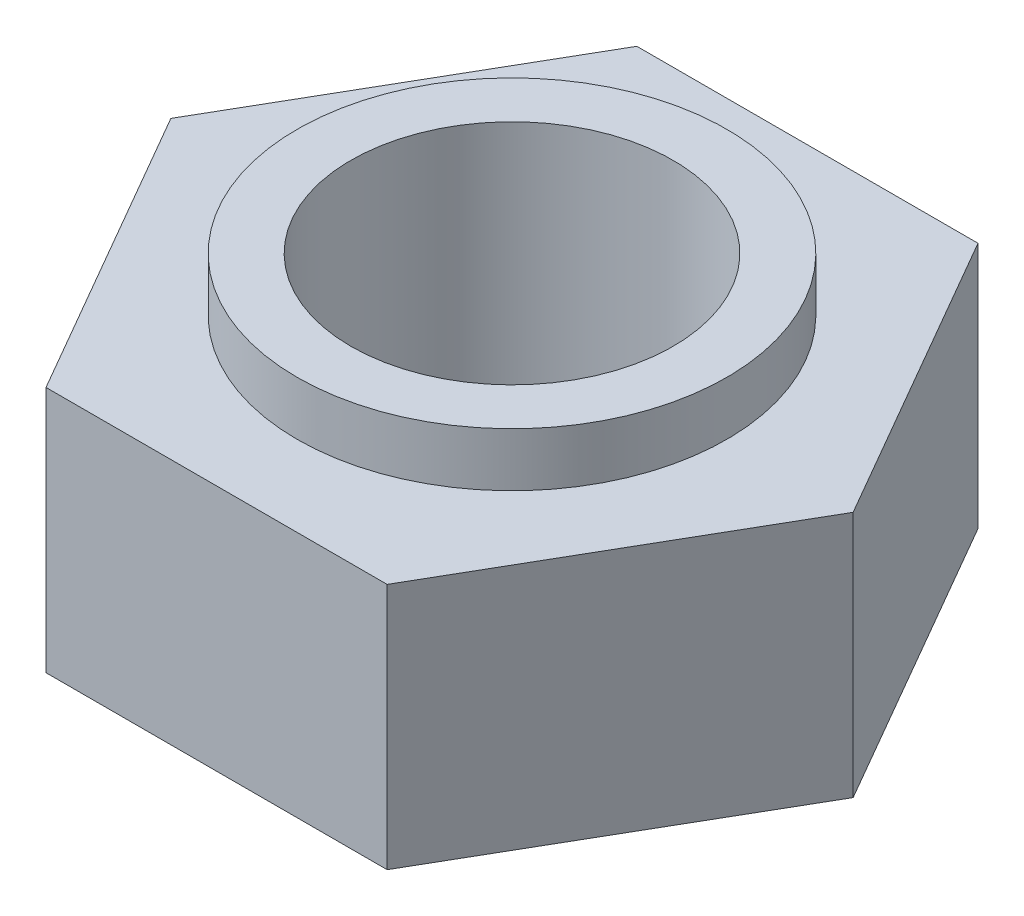
ISO-10303-21;
HEADER;
FILE_DESCRIPTION(('STEP AP214'),'2;1');
FILE_NAME('part.step','',(''),(''),'','','');
FILE_SCHEMA(('AUTOMOTIVE_DESIGN { 1 0 10303 214 1 1 1 1 }'));
ENDSEC;
DATA;
#1=APPLICATION_CONTEXT('core data for automotive mechanical design processes');
#2=APPLICATION_PROTOCOL_DEFINITION('international standard','automotive_design',2000,#1);
#3=PRODUCT_CONTEXT('',#1,'mechanical');
#4=PRODUCT('Part','Part','',(#3));
#5=PRODUCT_RELATED_PRODUCT_CATEGORY('part','',(#4));
#6=PRODUCT_DEFINITION_FORMATION('','',#4);
#7=PRODUCT_DEFINITION_CONTEXT('part definition',#1,'design');
#8=PRODUCT_DEFINITION('design','',#6,#7);
#9=PRODUCT_DEFINITION_SHAPE('','',#8);
#10=(LENGTH_UNIT() NAMED_UNIT(*) SI_UNIT(.MILLI.,.METRE.));
#11=(NAMED_UNIT(*) PLANE_ANGLE_UNIT() SI_UNIT($,.RADIAN.));
#12=(NAMED_UNIT(*) SI_UNIT($,.STERADIAN.) SOLID_ANGLE_UNIT());
#13=UNCERTAINTY_MEASURE_WITH_UNIT(LENGTH_MEASURE(1.E-05),#10,'distance_accuracy_value','');
#14=(GEOMETRIC_REPRESENTATION_CONTEXT(3) GLOBAL_UNCERTAINTY_ASSIGNED_CONTEXT((#13)) GLOBAL_UNIT_ASSIGNED_CONTEXT((#10,
#11,#12)) REPRESENTATION_CONTEXT('',''));
#15=CARTESIAN_POINT('',(0.,0.,0.));
#16=DIRECTION('',(0.,0.,1.));
#17=DIRECTION('',(1.,0.,0.));
#18=AXIS2_PLACEMENT_3D('',#15,#16,#17);
#19=CARTESIAN_POINT('',(0.,2.3,0.));
#20=DIRECTION('',(0.,1.,0.));
#21=DIRECTION('',(0.,0.,1.));
#22=AXIS2_PLACEMENT_3D('',#19,#20,#21);
#23=PLANE('',#22);
#24=DIRECTION('',(0.5,0.,-0.866025403784439));
#25=VECTOR('',#24,1.);
#26=CARTESIAN_POINT('',(1.58771324027147,2.3,2.75000000000001));
#27=LINE('',#26,#25);
#28=CARTESIAN_POINT('',(1.58771324027147,2.3,2.75000000000001));
#29=VERTEX_POINT('',#28);
#30=CARTESIAN_POINT('',(3.17542648054294,2.3,0.));
#31=VERTEX_POINT('',#30);
#32=EDGE_CURVE('E129',#29,#31,#27,.T.);
#33=ORIENTED_EDGE('',*,*,#32,.T.);
#34=DIRECTION('',(-0.500000000000001,0.,-0.866025403784438));
#35=VECTOR('',#34,1.);
#36=CARTESIAN_POINT('',(3.17542648054294,2.3,0.));
#37=LINE('',#36,#35);
#38=CARTESIAN_POINT('',(1.58771324027147,2.3,-2.75000000000001));
#39=VERTEX_POINT('',#38);
#40=EDGE_CURVE('E87',#31,#39,#37,.T.);
#41=ORIENTED_EDGE('',*,*,#40,.T.);
#42=DIRECTION('',(-1.,0.,0.));
#43=VECTOR('',#42,1.);
#44=CARTESIAN_POINT('',(1.58771324027147,2.3,-2.75000000000001));
#45=LINE('',#44,#43);
#46=CARTESIAN_POINT('',(-1.58771324027147,2.3,-2.75000000000001));
#47=VERTEX_POINT('',#46);
#48=EDGE_CURVE('E100',#39,#47,#45,.T.);
#49=ORIENTED_EDGE('',*,*,#48,.T.);
#50=DIRECTION('',(-0.5,0.,0.866025403784439));
#51=VECTOR('',#50,1.);
#52=CARTESIAN_POINT('',(-1.58771324027147,2.3,-2.75000000000001));
#53=LINE('',#52,#51);
#54=CARTESIAN_POINT('',(-3.17542648054295,2.3,0.));
#55=VERTEX_POINT('',#54);
#56=EDGE_CURVE('E94',#47,#55,#53,.T.);
#57=ORIENTED_EDGE('',*,*,#56,.T.);
#58=DIRECTION('',(0.5,0.,0.866025403784439));
#59=VECTOR('',#58,1.);
#60=CARTESIAN_POINT('',(-3.17542648054295,2.3,0.));
#61=LINE('',#60,#59);
#62=CARTESIAN_POINT('',(-1.58771324027148,2.3,2.75000000000001));
#63=VERTEX_POINT('',#62);
#64=EDGE_CURVE('E98',#55,#63,#61,.T.);
#65=ORIENTED_EDGE('',*,*,#64,.T.);
#66=DIRECTION('',(1.,0.,0.));
#67=VECTOR('',#66,1.);
#68=CARTESIAN_POINT('',(-1.58771324027148,2.3,2.75000000000001));
#69=LINE('',#68,#67);
#70=EDGE_CURVE('E50',#63,#29,#69,.T.);
#71=ORIENTED_EDGE('',*,*,#70,.T.);
#72=EDGE_LOOP('',(#33,#41,#49,#57,#65,#71));
#73=FACE_BOUND('',#72,.T.);
#74=CARTESIAN_POINT('',(0.,2.3,0.));
#75=DIRECTION('',(0.,1.,0.));
#76=DIRECTION('',(0.,0.,1.));
#77=AXIS2_PLACEMENT_3D('',#74,#75,#76);
#78=CIRCLE('',#77,2.);
#79=CARTESIAN_POINT('',(0.,2.3,2.));
#80=VERTEX_POINT('',#79);
#81=EDGE_CURVE('E180',#80,#80,#78,.T.);
#82=ORIENTED_EDGE('',*,*,#81,.F.);
#83=EDGE_LOOP('',(#82));
#84=FACE_BOUND('',#83,.T.);
#85=ADVANCED_FACE('F33',(#73,#84),#23,.T.);
#86=CARTESIAN_POINT('',(0.,0.,0.));
#87=DIRECTION('',(0.,1.,0.));
#88=DIRECTION('',(0.,0.,1.));
#89=AXIS2_PLACEMENT_3D('',#86,#87,#88);
#90=PLANE('',#89);
#91=DIRECTION('',(0.5,0.,-0.866025403784439));
#92=VECTOR('',#91,1.);
#93=CARTESIAN_POINT('',(1.58771324027147,0.,2.75000000000001));
#94=LINE('',#93,#92);
#95=CARTESIAN_POINT('',(1.58771324027147,0.,2.75000000000001));
#96=VERTEX_POINT('',#95);
#97=CARTESIAN_POINT('',(3.17542648054294,0.,0.));
#98=VERTEX_POINT('',#97);
#99=EDGE_CURVE('E118',#96,#98,#94,.T.);
#100=ORIENTED_EDGE('',*,*,#99,.F.);
#101=DIRECTION('',(1.,0.,0.));
#102=VECTOR('',#101,1.);
#103=CARTESIAN_POINT('',(-1.58771324027148,0.,2.75000000000001));
#104=LINE('',#103,#102);
#105=CARTESIAN_POINT('',(-1.58771324027148,0.,2.75000000000001));
#106=VERTEX_POINT('',#105);
#107=EDGE_CURVE('E79',#106,#96,#104,.T.);
#108=ORIENTED_EDGE('',*,*,#107,.F.);
#109=DIRECTION('',(0.5,0.,0.866025403784439));
#110=VECTOR('',#109,1.);
#111=CARTESIAN_POINT('',(-3.17542648054295,0.,0.));
#112=LINE('',#111,#110);
#113=CARTESIAN_POINT('',(-3.17542648054295,0.,0.));
#114=VERTEX_POINT('',#113);
#115=EDGE_CURVE('E73',#114,#106,#112,.T.);
#116=ORIENTED_EDGE('',*,*,#115,.F.);
#117=DIRECTION('',(-0.5,0.,0.866025403784439));
#118=VECTOR('',#117,1.);
#119=CARTESIAN_POINT('',(-1.58771324027147,0.,-2.75000000000001));
#120=LINE('',#119,#118);
#121=CARTESIAN_POINT('',(-1.58771324027147,0.,-2.75000000000001));
#122=VERTEX_POINT('',#121);
#123=EDGE_CURVE('E108',#122,#114,#120,.T.);
#124=ORIENTED_EDGE('',*,*,#123,.F.);
#125=DIRECTION('',(-1.,0.,0.));
#126=VECTOR('',#125,1.);
#127=CARTESIAN_POINT('',(1.58771324027147,0.,-2.75000000000001));
#128=LINE('',#127,#126);
#129=CARTESIAN_POINT('',(1.58771324027147,0.,-2.75000000000001));
#130=VERTEX_POINT('',#129);
#131=EDGE_CURVE('E124',#130,#122,#128,.T.);
#132=ORIENTED_EDGE('',*,*,#131,.F.);
#133=DIRECTION('',(-0.500000000000001,0.,-0.866025403784438));
#134=VECTOR('',#133,1.);
#135=CARTESIAN_POINT('',(3.17542648054294,0.,0.));
#136=LINE('',#135,#134);
#137=EDGE_CURVE('E121',#98,#130,#136,.T.);
#138=ORIENTED_EDGE('',*,*,#137,.F.);
#139=EDGE_LOOP('',(#100,#108,#116,#124,#132,#138));
#140=FACE_BOUND('',#139,.T.);
#141=CARTESIAN_POINT('',(0.,0.,0.));
#142=DIRECTION('',(0.,1.,0.));
#143=DIRECTION('',(0.,0.,1.));
#144=AXIS2_PLACEMENT_3D('',#141,#142,#143);
#145=CIRCLE('',#144,1.5);
#146=CARTESIAN_POINT('',(0.,0.,1.5));
#147=VERTEX_POINT('',#146);
#148=EDGE_CURVE('E122',#147,#147,#145,.T.);
#149=ORIENTED_EDGE('',*,*,#148,.T.);
#150=EDGE_LOOP('',(#149));
#151=FACE_BOUND('',#150,.T.);
#152=ADVANCED_FACE('F138',(#140,#151),#90,.F.);
#153=CARTESIAN_POINT('',(1.58771324027147,2.3,2.75000000000001));
#154=DIRECTION('',(-0.866025403784439,0.,-0.5));
#155=DIRECTION('',(-0.5,0.,0.866025403784439));
#156=AXIS2_PLACEMENT_3D('',#153,#154,#155);
#157=PLANE('',#156);
#158=ORIENTED_EDGE('',*,*,#99,.T.);
#159=DIRECTION('',(0.,-1.,0.));
#160=VECTOR('',#159,1.);
#161=CARTESIAN_POINT('',(3.17542648054294,2.3,0.));
#162=LINE('',#161,#160);
#163=EDGE_CURVE('E11',#31,#98,#162,.T.);
#164=ORIENTED_EDGE('',*,*,#163,.F.);
#165=ORIENTED_EDGE('',*,*,#32,.F.);
#166=DIRECTION('',(0.,-1.,0.));
#167=VECTOR('',#166,1.);
#168=CARTESIAN_POINT('',(1.58771324027147,2.3,2.75000000000001));
#169=LINE('',#168,#167);
#170=EDGE_CURVE('E114',#29,#96,#169,.T.);
#171=ORIENTED_EDGE('',*,*,#170,.T.);
#172=EDGE_LOOP('',(#158,#164,#165,#171));
#173=FACE_BOUND('',#172,.T.);
#174=ADVANCED_FACE('F35',(#173),#157,.F.);
#175=CARTESIAN_POINT('',(3.17542648054294,2.3,0.));
#176=DIRECTION('',(-0.866025403784438,0.,0.500000000000001));
#177=DIRECTION('',(0.500000000000001,0.,0.866025403784438));
#178=AXIS2_PLACEMENT_3D('',#175,#176,#177);
#179=PLANE('',#178);
#180=ORIENTED_EDGE('',*,*,#137,.T.);
#181=DIRECTION('',(0.,-1.,0.));
#182=VECTOR('',#181,1.);
#183=CARTESIAN_POINT('',(1.58771324027147,2.3,-2.75000000000001));
#184=LINE('',#183,#182);
#185=EDGE_CURVE('E42',#39,#130,#184,.T.);
#186=ORIENTED_EDGE('',*,*,#185,.F.);
#187=ORIENTED_EDGE('',*,*,#40,.F.);
#188=ORIENTED_EDGE('',*,*,#163,.T.);
#189=EDGE_LOOP('',(#180,#186,#187,#188));
#190=FACE_BOUND('',#189,.T.);
#191=ADVANCED_FACE('F235',(#190),#179,.F.);
#192=CARTESIAN_POINT('',(1.58771324027147,2.3,-2.75000000000001));
#193=DIRECTION('',(0.,0.,1.));
#194=DIRECTION('',(1.,0.,0.));
#195=AXIS2_PLACEMENT_3D('',#192,#193,#194);
#196=PLANE('',#195);
#197=ORIENTED_EDGE('',*,*,#131,.T.);
#198=DIRECTION('',(0.,-1.,0.));
#199=VECTOR('',#198,1.);
#200=CARTESIAN_POINT('',(-1.58771324027147,2.3,-2.75000000000001));
#201=LINE('',#200,#199);
#202=EDGE_CURVE('E109',#47,#122,#201,.T.);
#203=ORIENTED_EDGE('',*,*,#202,.F.);
#204=ORIENTED_EDGE('',*,*,#48,.F.);
#205=ORIENTED_EDGE('',*,*,#185,.T.);
#206=EDGE_LOOP('',(#197,#203,#204,#205));
#207=FACE_BOUND('',#206,.T.);
#208=ADVANCED_FACE('F135',(#207),#196,.F.);
#209=CARTESIAN_POINT('',(-1.58771324027147,2.3,-2.75000000000001));
#210=DIRECTION('',(0.866025403784439,0.,0.5));
#211=DIRECTION('',(0.5,0.,-0.866025403784439));
#212=AXIS2_PLACEMENT_3D('',#209,#210,#211);
#213=PLANE('',#212);
#214=ORIENTED_EDGE('',*,*,#123,.T.);
#215=DIRECTION('',(0.,-1.,0.));
#216=VECTOR('',#215,1.);
#217=CARTESIAN_POINT('',(-3.17542648054295,2.3,0.));
#218=LINE('',#217,#216);
#219=EDGE_CURVE('E105',#55,#114,#218,.T.);
#220=ORIENTED_EDGE('',*,*,#219,.F.);
#221=ORIENTED_EDGE('',*,*,#56,.F.);
#222=ORIENTED_EDGE('',*,*,#202,.T.);
#223=EDGE_LOOP('',(#214,#220,#221,#222));
#224=FACE_BOUND('',#223,.T.);
#225=ADVANCED_FACE('F106',(#224),#213,.F.);
#226=CARTESIAN_POINT('',(-3.17542648054295,2.3,0.));
#227=DIRECTION('',(0.866025403784439,0.,-0.5));
#228=DIRECTION('',(-0.5,0.,-0.866025403784439));
#229=AXIS2_PLACEMENT_3D('',#226,#227,#228);
#230=PLANE('',#229);
#231=ORIENTED_EDGE('',*,*,#115,.T.);
#232=DIRECTION('',(0.,-1.,0.));
#233=VECTOR('',#232,1.);
#234=CARTESIAN_POINT('',(-1.58771324027148,2.3,2.75000000000001));
#235=LINE('',#234,#233);
#236=EDGE_CURVE('E110',#63,#106,#235,.T.);
#237=ORIENTED_EDGE('',*,*,#236,.F.);
#238=ORIENTED_EDGE('',*,*,#64,.F.);
#239=ORIENTED_EDGE('',*,*,#219,.T.);
#240=EDGE_LOOP('',(#231,#237,#238,#239));
#241=FACE_BOUND('',#240,.T.);
#242=ADVANCED_FACE('F112',(#241),#230,.F.);
#243=CARTESIAN_POINT('',(-1.58771324027148,2.3,2.75000000000001));
#244=DIRECTION('',(0.,0.,-1.));
#245=DIRECTION('',(-1.,0.,0.));
#246=AXIS2_PLACEMENT_3D('',#243,#244,#245);
#247=PLANE('',#246);
#248=ORIENTED_EDGE('',*,*,#107,.T.);
#249=ORIENTED_EDGE('',*,*,#170,.F.);
#250=ORIENTED_EDGE('',*,*,#70,.F.);
#251=ORIENTED_EDGE('',*,*,#236,.T.);
#252=EDGE_LOOP('',(#248,#249,#250,#251));
#253=FACE_BOUND('',#252,.T.);
#254=ADVANCED_FACE('F143',(#253),#247,.F.);
#255=CARTESIAN_POINT('',(0.,2.3,0.));
#256=DIRECTION('',(0.,-1.,0.));
#257=DIRECTION('',(0.,0.,-1.));
#258=AXIS2_PLACEMENT_3D('',#255,#256,#257);
#259=CYLINDRICAL_SURFACE('',#258,1.5);
#260=ORIENTED_EDGE('',*,*,#148,.F.);
#261=EDGE_LOOP('',(#260));
#262=FACE_BOUND('',#261,.T.);
#263=CARTESIAN_POINT('',(0.,2.8,0.));
#264=DIRECTION('',(0.,1.,0.));
#265=DIRECTION('',(0.,0.,1.));
#266=AXIS2_PLACEMENT_3D('',#263,#264,#265);
#267=CIRCLE('',#266,1.5);
#268=CARTESIAN_POINT('',(0.,2.8,1.5));
#269=VERTEX_POINT('',#268);
#270=EDGE_CURVE('E178',#269,#269,#267,.T.);
#271=ORIENTED_EDGE('',*,*,#270,.T.);
#272=EDGE_LOOP('',(#271));
#273=FACE_BOUND('',#272,.T.);
#274=ADVANCED_FACE('F145',(#262,#273),#259,.F.);
#275=CARTESIAN_POINT('',(0.,2.8,0.));
#276=DIRECTION('',(0.,1.,0.));
#277=DIRECTION('',(0.,0.,1.));
#278=AXIS2_PLACEMENT_3D('',#275,#276,#277);
#279=PLANE('',#278);
#280=CARTESIAN_POINT('',(0.,2.8,0.));
#281=DIRECTION('',(0.,1.,0.));
#282=DIRECTION('',(0.,0.,1.));
#283=AXIS2_PLACEMENT_3D('',#280,#281,#282);
#284=CIRCLE('',#283,2.);
#285=CARTESIAN_POINT('',(0.,2.8,2.));
#286=VERTEX_POINT('',#285);
#287=EDGE_CURVE('E175',#286,#286,#284,.T.);
#288=ORIENTED_EDGE('',*,*,#287,.T.);
#289=EDGE_LOOP('',(#288));
#290=FACE_BOUND('',#289,.T.);
#291=ORIENTED_EDGE('',*,*,#270,.F.);
#292=EDGE_LOOP('',(#291));
#293=FACE_BOUND('',#292,.T.);
#294=ADVANCED_FACE('F152',(#290,#293),#279,.T.);
#295=CARTESIAN_POINT('',(0.,2.8,0.));
#296=DIRECTION('',(0.,-1.,0.));
#297=DIRECTION('',(0.,0.,-1.));
#298=AXIS2_PLACEMENT_3D('',#295,#296,#297);
#299=CYLINDRICAL_SURFACE('',#298,2.);
#300=ORIENTED_EDGE('',*,*,#287,.F.);
#301=EDGE_LOOP('',(#300));
#302=FACE_BOUND('',#301,.T.);
#303=ORIENTED_EDGE('',*,*,#81,.T.);
#304=EDGE_LOOP('',(#303));
#305=FACE_BOUND('',#304,.T.);
#306=ADVANCED_FACE('F164',(#302,#305),#299,.T.);
#307=CLOSED_SHELL('',(#85,#152,#174,#191,#208,#225,#242,#254,#274,#294,#306));
#308=MANIFOLD_SOLID_BREP('B2',#307);
#309=ADVANCED_BREP_SHAPE_REPRESENTATION('',(#18,#308),#14);
#310=SHAPE_DEFINITION_REPRESENTATION(#9,#309);
ENDSEC;
END-ISO-10303-21;
